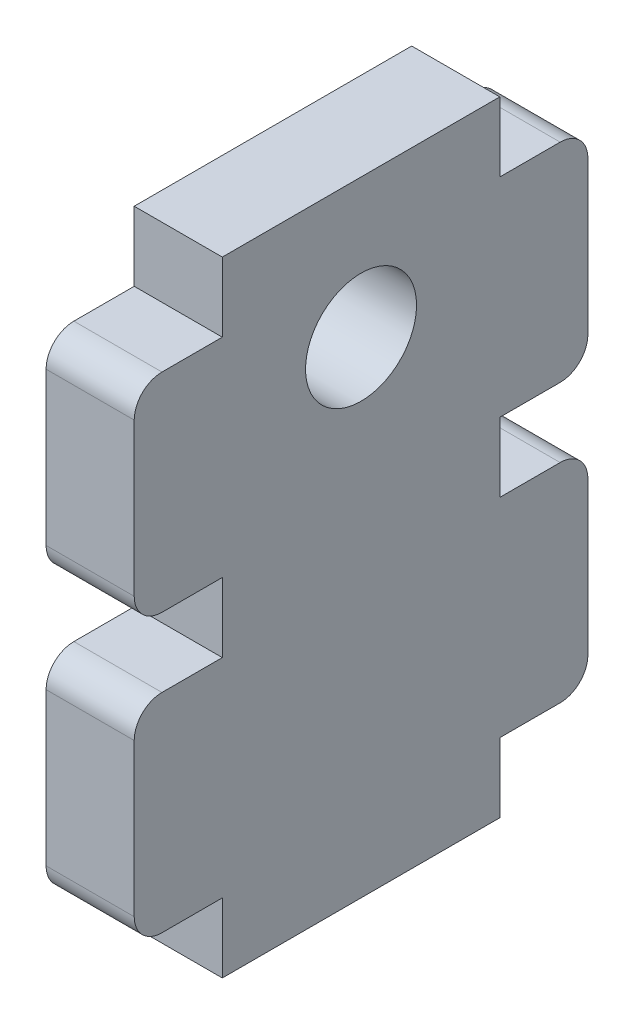
ISO-10303-21;
HEADER;
FILE_DESCRIPTION(('STEP AP214'),'2;1');
FILE_NAME('part.step','',(''),(''),'','','');
FILE_SCHEMA(('AUTOMOTIVE_DESIGN { 1 0 10303 214 1 1 1 1 }'));
ENDSEC;
DATA;
#1=APPLICATION_CONTEXT('core data for automotive mechanical design processes');
#2=APPLICATION_PROTOCOL_DEFINITION('international standard','automotive_design',2000,#1);
#3=PRODUCT_CONTEXT('',#1,'mechanical');
#4=PRODUCT('Part','Part','',(#3));
#5=PRODUCT_RELATED_PRODUCT_CATEGORY('part','',(#4));
#6=PRODUCT_DEFINITION_FORMATION('','',#4);
#7=PRODUCT_DEFINITION_CONTEXT('part definition',#1,'design');
#8=PRODUCT_DEFINITION('design','',#6,#7);
#9=PRODUCT_DEFINITION_SHAPE('','',#8);
#10=(LENGTH_UNIT() NAMED_UNIT(*) SI_UNIT(.MILLI.,.METRE.));
#11=(NAMED_UNIT(*) PLANE_ANGLE_UNIT() SI_UNIT($,.RADIAN.));
#12=(NAMED_UNIT(*) SI_UNIT($,.STERADIAN.) SOLID_ANGLE_UNIT());
#13=UNCERTAINTY_MEASURE_WITH_UNIT(LENGTH_MEASURE(1.E-05),#10,'distance_accuracy_value','');
#14=(GEOMETRIC_REPRESENTATION_CONTEXT(3) GLOBAL_UNCERTAINTY_ASSIGNED_CONTEXT((#13)) GLOBAL_UNIT_ASSIGNED_CONTEXT((#10,
#11,#12)) REPRESENTATION_CONTEXT('',''));
#15=CARTESIAN_POINT('',(0.,0.,0.));
#16=DIRECTION('',(0.,0.,1.));
#17=DIRECTION('',(1.,0.,0.));
#18=AXIS2_PLACEMENT_3D('',#15,#16,#17);
#19=CARTESIAN_POINT('',(6.35,0.,0.));
#20=DIRECTION('',(0.,0.,-1.));
#21=DIRECTION('',(-1.,0.,0.));
#22=AXIS2_PLACEMENT_3D('',#19,#20,#21);
#23=PLANE('',#22);
#24=DIRECTION('',(0.,-1.,0.));
#25=VECTOR('',#24,1.);
#26=CARTESIAN_POINT('',(0.,0.,0.));
#27=LINE('',#26,#25);
#28=CARTESIAN_POINT('',(0.,5.,0.));
#29=VERTEX_POINT('',#28);
#30=CARTESIAN_POINT('',(0.,0.,0.));
#31=VERTEX_POINT('',#30);
#32=EDGE_CURVE('E245',#29,#31,#27,.T.);
#33=ORIENTED_EDGE('',*,*,#32,.T.);
#34=DIRECTION('',(-1.,0.,0.));
#35=VECTOR('',#34,1.);
#36=CARTESIAN_POINT('',(6.35,0.,0.));
#37=LINE('',#36,#35);
#38=CARTESIAN_POINT('',(6.35,0.,0.));
#39=VERTEX_POINT('',#38);
#40=EDGE_CURVE('E227',#39,#31,#37,.T.);
#41=ORIENTED_EDGE('',*,*,#40,.F.);
#42=DIRECTION('',(0.,-1.,0.));
#43=VECTOR('',#42,1.);
#44=CARTESIAN_POINT('',(6.35,0.,0.));
#45=LINE('',#44,#43);
#46=CARTESIAN_POINT('',(6.35,5.,0.));
#47=VERTEX_POINT('',#46);
#48=EDGE_CURVE('E233',#47,#39,#45,.T.);
#49=ORIENTED_EDGE('',*,*,#48,.F.);
#50=DIRECTION('',(-1.,0.,0.));
#51=VECTOR('',#50,1.);
#52=CARTESIAN_POINT('',(6.35,5.,0.));
#53=LINE('',#52,#51);
#54=EDGE_CURVE('E360',#47,#29,#53,.T.);
#55=ORIENTED_EDGE('',*,*,#54,.T.);
#56=EDGE_LOOP('',(#33,#41,#49,#55));
#57=FACE_BOUND('',#56,.T.);
#58=ADVANCED_FACE('F37',(#57),#23,.F.);
#59=CARTESIAN_POINT('',(6.35,0.,0.));
#60=DIRECTION('',(0.,1.,0.));
#61=DIRECTION('',(0.,0.,1.));
#62=AXIS2_PLACEMENT_3D('',#59,#60,#61);
#63=PLANE('',#62);
#64=DIRECTION('',(0.,0.,-1.));
#65=VECTOR('',#64,1.);
#66=CARTESIAN_POINT('',(0.,0.,0.));
#67=LINE('',#66,#65);
#68=CARTESIAN_POINT('',(0.,0.,-20.));
#69=VERTEX_POINT('',#68);
#70=EDGE_CURVE('E402',#31,#69,#67,.T.);
#71=ORIENTED_EDGE('',*,*,#70,.T.);
#72=DIRECTION('',(-1.,0.,0.));
#73=VECTOR('',#72,1.);
#74=CARTESIAN_POINT('',(6.35,0.,-20.));
#75=LINE('',#74,#73);
#76=CARTESIAN_POINT('',(6.35,0.,-20.));
#77=VERTEX_POINT('',#76);
#78=EDGE_CURVE('E230',#77,#69,#75,.T.);
#79=ORIENTED_EDGE('',*,*,#78,.F.);
#80=DIRECTION('',(0.,0.,-1.));
#81=VECTOR('',#80,1.);
#82=CARTESIAN_POINT('',(6.35,0.,0.));
#83=LINE('',#82,#81);
#84=EDGE_CURVE('E223',#39,#77,#83,.T.);
#85=ORIENTED_EDGE('',*,*,#84,.F.);
#86=ORIENTED_EDGE('',*,*,#40,.T.);
#87=EDGE_LOOP('',(#71,#79,#85,#86));
#88=FACE_BOUND('',#87,.T.);
#89=ADVANCED_FACE('F225',(#88),#63,.F.);
#90=CARTESIAN_POINT('',(6.35,0.,-20.));
#91=DIRECTION('',(0.,0.,1.));
#92=DIRECTION('',(0.,-1.,0.));
#93=AXIS2_PLACEMENT_3D('',#90,#91,#92);
#94=PLANE('',#93);
#95=DIRECTION('',(0.,1.,0.));
#96=VECTOR('',#95,1.);
#97=CARTESIAN_POINT('',(0.,0.,-20.));
#98=LINE('',#97,#96);
#99=CARTESIAN_POINT('',(0.,5.,-20.));
#100=VERTEX_POINT('',#99);
#101=EDGE_CURVE('E396',#69,#100,#98,.T.);
#102=ORIENTED_EDGE('',*,*,#101,.T.);
#103=DIRECTION('',(-1.,0.,0.));
#104=VECTOR('',#103,1.);
#105=CARTESIAN_POINT('',(6.35,5.,-20.));
#106=LINE('',#105,#104);
#107=CARTESIAN_POINT('',(6.35,5.,-20.));
#108=VERTEX_POINT('',#107);
#109=EDGE_CURVE('E250',#108,#100,#106,.T.);
#110=ORIENTED_EDGE('',*,*,#109,.F.);
#111=DIRECTION('',(0.,1.,0.));
#112=VECTOR('',#111,1.);
#113=CARTESIAN_POINT('',(6.35,0.,-20.));
#114=LINE('',#113,#112);
#115=EDGE_CURVE('E232',#77,#108,#114,.T.);
#116=ORIENTED_EDGE('',*,*,#115,.F.);
#117=ORIENTED_EDGE('',*,*,#78,.T.);
#118=EDGE_LOOP('',(#102,#110,#116,#117));
#119=FACE_BOUND('',#118,.T.);
#120=ADVANCED_FACE('F445',(#119),#94,.F.);
#121=CARTESIAN_POINT('',(6.35,5.,-20.));
#122=DIRECTION('',(0.,1.,0.));
#123=DIRECTION('',(0.,0.,1.));
#124=AXIS2_PLACEMENT_3D('',#121,#122,#123);
#125=PLANE('',#124);
#126=DIRECTION('',(0.,0.,-1.));
#127=VECTOR('',#126,1.);
#128=CARTESIAN_POINT('',(0.,5.,-20.));
#129=LINE('',#128,#127);
#130=CARTESIAN_POINT('',(0.,5.,-24.35));
#131=VERTEX_POINT('',#130);
#132=EDGE_CURVE('E391',#100,#131,#129,.T.);
#133=ORIENTED_EDGE('',*,*,#132,.T.);
#134=DIRECTION('',(-1.,0.,0.));
#135=VECTOR('',#134,1.);
#136=CARTESIAN_POINT('',(6.35,5.,-24.35));
#137=LINE('',#136,#135);
#138=CARTESIAN_POINT('',(6.35,5.,-24.35));
#139=VERTEX_POINT('',#138);
#140=EDGE_CURVE('E272',#131,#139,#137,.F.);
#141=ORIENTED_EDGE('',*,*,#140,.T.);
#142=DIRECTION('',(0.,0.,-1.));
#143=VECTOR('',#142,1.);
#144=CARTESIAN_POINT('',(6.35,5.,-20.));
#145=LINE('',#144,#143);
#146=EDGE_CURVE('E393',#108,#139,#145,.T.);
#147=ORIENTED_EDGE('',*,*,#146,.F.);
#148=ORIENTED_EDGE('',*,*,#109,.T.);
#149=EDGE_LOOP('',(#133,#141,#147,#148));
#150=FACE_BOUND('',#149,.T.);
#151=ADVANCED_FACE('F390',(#150),#125,.F.);
#152=CARTESIAN_POINT('',(6.35,20.,-26.35));
#153=DIRECTION('',(0.,0.,1.));
#154=DIRECTION('',(1.,0.,0.));
#155=AXIS2_PLACEMENT_3D('',#152,#153,#154);
#156=PLANE('',#155);
#157=DIRECTION('',(0.,1.,0.));
#158=VECTOR('',#157,1.);
#159=CARTESIAN_POINT('',(6.35,20.,-26.35));
#160=LINE('',#159,#158);
#161=CARTESIAN_POINT('',(6.35,7.,-26.35));
#162=VERTEX_POINT('',#161);
#163=CARTESIAN_POINT('',(6.35,18.,-26.35));
#164=VERTEX_POINT('',#163);
#165=EDGE_CURVE('E490',#162,#164,#160,.T.);
#166=ORIENTED_EDGE('',*,*,#165,.F.);
#167=DIRECTION('',(-1.,0.,0.));
#168=VECTOR('',#167,1.);
#169=CARTESIAN_POINT('',(6.35,7.,-26.35));
#170=LINE('',#169,#168);
#171=CARTESIAN_POINT('',(0.,7.,-26.35));
#172=VERTEX_POINT('',#171);
#173=EDGE_CURVE('E248',#162,#172,#170,.T.);
#174=ORIENTED_EDGE('',*,*,#173,.T.);
#175=DIRECTION('',(0.,1.,0.));
#176=VECTOR('',#175,1.);
#177=CARTESIAN_POINT('',(0.,20.,-26.35));
#178=LINE('',#177,#176);
#179=CARTESIAN_POINT('',(0.,18.,-26.35));
#180=VERTEX_POINT('',#179);
#181=EDGE_CURVE('E397',#172,#180,#178,.T.);
#182=ORIENTED_EDGE('',*,*,#181,.T.);
#183=DIRECTION('',(-1.,0.,0.));
#184=VECTOR('',#183,1.);
#185=CARTESIAN_POINT('',(6.35,18.,-26.35));
#186=LINE('',#185,#184);
#187=EDGE_CURVE('E246',#180,#164,#186,.F.);
#188=ORIENTED_EDGE('',*,*,#187,.T.);
#189=EDGE_LOOP('',(#166,#174,#182,#188));
#190=FACE_BOUND('',#189,.T.);
#191=ADVANCED_FACE('F576',(#190),#156,.F.);
#192=CARTESIAN_POINT('',(6.35,20.,-20.));
#193=DIRECTION('',(0.,-1.,0.));
#194=DIRECTION('',(0.,0.,-1.));
#195=AXIS2_PLACEMENT_3D('',#192,#193,#194);
#196=PLANE('',#195);
#197=DIRECTION('',(0.,0.,1.));
#198=VECTOR('',#197,1.);
#199=CARTESIAN_POINT('',(6.35,20.,-20.));
#200=LINE('',#199,#198);
#201=CARTESIAN_POINT('',(6.35,20.,-24.35));
#202=VERTEX_POINT('',#201);
#203=CARTESIAN_POINT('',(6.35,20.,-20.));
#204=VERTEX_POINT('',#203);
#205=EDGE_CURVE('E495',#202,#204,#200,.T.);
#206=ORIENTED_EDGE('',*,*,#205,.F.);
#207=DIRECTION('',(-1.,0.,0.));
#208=VECTOR('',#207,1.);
#209=CARTESIAN_POINT('',(6.35,20.,-24.35));
#210=LINE('',#209,#208);
#211=CARTESIAN_POINT('',(0.,20.,-24.35));
#212=VERTEX_POINT('',#211);
#213=EDGE_CURVE('E289',#202,#212,#210,.T.);
#214=ORIENTED_EDGE('',*,*,#213,.T.);
#215=DIRECTION('',(0.,0.,1.));
#216=VECTOR('',#215,1.);
#217=CARTESIAN_POINT('',(0.,20.,-20.));
#218=LINE('',#217,#216);
#219=CARTESIAN_POINT('',(0.,20.,-20.));
#220=VERTEX_POINT('',#219);
#221=EDGE_CURVE('E400',#212,#220,#218,.T.);
#222=ORIENTED_EDGE('',*,*,#221,.T.);
#223=DIRECTION('',(-1.,0.,0.));
#224=VECTOR('',#223,1.);
#225=CARTESIAN_POINT('',(6.35,20.,-20.));
#226=LINE('',#225,#224);
#227=EDGE_CURVE('E382',#204,#220,#226,.T.);
#228=ORIENTED_EDGE('',*,*,#227,.F.);
#229=EDGE_LOOP('',(#206,#214,#222,#228));
#230=FACE_BOUND('',#229,.T.);
#231=ADVANCED_FACE('F572',(#230),#196,.F.);
#232=CARTESIAN_POINT('',(6.35,20.,-20.));
#233=DIRECTION('',(0.,0.,1.));
#234=DIRECTION('',(0.,-1.,0.));
#235=AXIS2_PLACEMENT_3D('',#232,#233,#234);
#236=PLANE('',#235);
#237=DIRECTION('',(0.,1.,0.));
#238=VECTOR('',#237,1.);
#239=CARTESIAN_POINT('',(0.,20.,-20.));
#240=LINE('',#239,#238);
#241=CARTESIAN_POINT('',(0.,25.,-20.));
#242=VERTEX_POINT('',#241);
#243=EDGE_CURVE('E407',#220,#242,#240,.T.);
#244=ORIENTED_EDGE('',*,*,#243,.T.);
#245=DIRECTION('',(-1.,0.,0.));
#246=VECTOR('',#245,1.);
#247=CARTESIAN_POINT('',(6.35,25.,-20.));
#248=LINE('',#247,#246);
#249=CARTESIAN_POINT('',(6.35,25.,-20.));
#250=VERTEX_POINT('',#249);
#251=EDGE_CURVE('E379',#250,#242,#248,.T.);
#252=ORIENTED_EDGE('',*,*,#251,.F.);
#253=DIRECTION('',(0.,1.,0.));
#254=VECTOR('',#253,1.);
#255=CARTESIAN_POINT('',(6.35,20.,-20.));
#256=LINE('',#255,#254);
#257=EDGE_CURVE('E497',#204,#250,#256,.T.);
#258=ORIENTED_EDGE('',*,*,#257,.F.);
#259=ORIENTED_EDGE('',*,*,#227,.T.);
#260=EDGE_LOOP('',(#244,#252,#258,#259));
#261=FACE_BOUND('',#260,.T.);
#262=ADVANCED_FACE('F568',(#261),#236,.F.);
#263=CARTESIAN_POINT('',(6.35,25.,-20.));
#264=DIRECTION('',(0.,1.,0.));
#265=DIRECTION('',(0.,0.,1.));
#266=AXIS2_PLACEMENT_3D('',#263,#264,#265);
#267=PLANE('',#266);
#268=DIRECTION('',(0.,0.,-1.));
#269=VECTOR('',#268,1.);
#270=CARTESIAN_POINT('',(0.,25.,-20.));
#271=LINE('',#270,#269);
#272=CARTESIAN_POINT('',(0.,25.,-24.35));
#273=VERTEX_POINT('',#272);
#274=EDGE_CURVE('E409',#242,#273,#271,.T.);
#275=ORIENTED_EDGE('',*,*,#274,.T.);
#276=DIRECTION('',(-1.,0.,0.));
#277=VECTOR('',#276,1.);
#278=CARTESIAN_POINT('',(6.35,25.,-24.35));
#279=LINE('',#278,#277);
#280=CARTESIAN_POINT('',(6.35,25.,-24.35));
#281=VERTEX_POINT('',#280);
#282=EDGE_CURVE('E297',#273,#281,#279,.F.);
#283=ORIENTED_EDGE('',*,*,#282,.T.);
#284=DIRECTION('',(0.,0.,-1.));
#285=VECTOR('',#284,1.);
#286=CARTESIAN_POINT('',(6.35,25.,-20.));
#287=LINE('',#286,#285);
#288=EDGE_CURVE('E499',#250,#281,#287,.T.);
#289=ORIENTED_EDGE('',*,*,#288,.F.);
#290=ORIENTED_EDGE('',*,*,#251,.T.);
#291=EDGE_LOOP('',(#275,#283,#289,#290));
#292=FACE_BOUND('',#291,.T.);
#293=ADVANCED_FACE('F564',(#292),#267,.F.);
#294=CARTESIAN_POINT('',(6.35,40.,-26.35));
#295=DIRECTION('',(0.,0.,1.));
#296=DIRECTION('',(0.,-1.,0.));
#297=AXIS2_PLACEMENT_3D('',#294,#295,#296);
#298=PLANE('',#297);
#299=DIRECTION('',(0.,1.,0.));
#300=VECTOR('',#299,1.);
#301=CARTESIAN_POINT('',(6.35,40.,-26.35));
#302=LINE('',#301,#300);
#303=CARTESIAN_POINT('',(6.35,27.,-26.35));
#304=VERTEX_POINT('',#303);
#305=CARTESIAN_POINT('',(6.35,38.,-26.35));
#306=VERTEX_POINT('',#305);
#307=EDGE_CURVE('E502',#304,#306,#302,.T.);
#308=ORIENTED_EDGE('',*,*,#307,.F.);
#309=DIRECTION('',(-1.,0.,0.));
#310=VECTOR('',#309,1.);
#311=CARTESIAN_POINT('',(6.35,27.,-26.35));
#312=LINE('',#311,#310);
#313=CARTESIAN_POINT('',(0.,27.,-26.35));
#314=VERTEX_POINT('',#313);
#315=EDGE_CURVE('E294',#304,#314,#312,.T.);
#316=ORIENTED_EDGE('',*,*,#315,.T.);
#317=DIRECTION('',(0.,1.,0.));
#318=VECTOR('',#317,1.);
#319=CARTESIAN_POINT('',(0.,40.,-26.35));
#320=LINE('',#319,#318);
#321=CARTESIAN_POINT('',(0.,38.,-26.35));
#322=VERTEX_POINT('',#321);
#323=EDGE_CURVE('E412',#314,#322,#320,.T.);
#324=ORIENTED_EDGE('',*,*,#323,.T.);
#325=DIRECTION('',(-1.,0.,0.));
#326=VECTOR('',#325,1.);
#327=CARTESIAN_POINT('',(6.35,38.,-26.35));
#328=LINE('',#327,#326);
#329=EDGE_CURVE('E292',#322,#306,#328,.F.);
#330=ORIENTED_EDGE('',*,*,#329,.T.);
#331=EDGE_LOOP('',(#308,#316,#324,#330));
#332=FACE_BOUND('',#331,.T.);
#333=ADVANCED_FACE('F560',(#332),#298,.F.);
#334=CARTESIAN_POINT('',(6.35,40.,-20.));
#335=DIRECTION('',(0.,-1.,0.));
#336=DIRECTION('',(0.,0.,-1.));
#337=AXIS2_PLACEMENT_3D('',#334,#335,#336);
#338=PLANE('',#337);
#339=DIRECTION('',(0.,0.,1.));
#340=VECTOR('',#339,1.);
#341=CARTESIAN_POINT('',(6.35,40.,-20.));
#342=LINE('',#341,#340);
#343=CARTESIAN_POINT('',(6.35,40.,-24.35));
#344=VERTEX_POINT('',#343);
#345=CARTESIAN_POINT('',(6.35,40.,-20.));
#346=VERTEX_POINT('',#345);
#347=EDGE_CURVE('E505',#344,#346,#342,.T.);
#348=ORIENTED_EDGE('',*,*,#347,.F.);
#349=DIRECTION('',(-1.,0.,0.));
#350=VECTOR('',#349,1.);
#351=CARTESIAN_POINT('',(6.35,40.,-24.35));
#352=LINE('',#351,#350);
#353=CARTESIAN_POINT('',(0.,40.,-24.35));
#354=VERTEX_POINT('',#353);
#355=EDGE_CURVE('E299',#344,#354,#352,.T.);
#356=ORIENTED_EDGE('',*,*,#355,.T.);
#357=DIRECTION('',(0.,0.,1.));
#358=VECTOR('',#357,1.);
#359=CARTESIAN_POINT('',(0.,40.,-20.));
#360=LINE('',#359,#358);
#361=CARTESIAN_POINT('',(0.,40.,-20.));
#362=VERTEX_POINT('',#361);
#363=EDGE_CURVE('E415',#354,#362,#360,.T.);
#364=ORIENTED_EDGE('',*,*,#363,.T.);
#365=DIRECTION('',(-1.,0.,0.));
#366=VECTOR('',#365,1.);
#367=CARTESIAN_POINT('',(6.35,40.,-20.));
#368=LINE('',#367,#366);
#369=EDGE_CURVE('E376',#346,#362,#368,.T.);
#370=ORIENTED_EDGE('',*,*,#369,.F.);
#371=EDGE_LOOP('',(#348,#356,#364,#370));
#372=FACE_BOUND('',#371,.T.);
#373=ADVANCED_FACE('F556',(#372),#338,.F.);
#374=CARTESIAN_POINT('',(6.35,40.,-20.));
#375=DIRECTION('',(0.,0.,1.));
#376=DIRECTION('',(1.,0.,0.));
#377=AXIS2_PLACEMENT_3D('',#374,#375,#376);
#378=PLANE('',#377);
#379=DIRECTION('',(0.,1.,0.));
#380=VECTOR('',#379,1.);
#381=CARTESIAN_POINT('',(0.,40.,-20.));
#382=LINE('',#381,#380);
#383=CARTESIAN_POINT('',(0.,45.,-20.));
#384=VERTEX_POINT('',#383);
#385=EDGE_CURVE('E417',#362,#384,#382,.T.);
#386=ORIENTED_EDGE('',*,*,#385,.T.);
#387=DIRECTION('',(-1.,0.,0.));
#388=VECTOR('',#387,1.);
#389=CARTESIAN_POINT('',(6.35,45.,-20.));
#390=LINE('',#389,#388);
#391=CARTESIAN_POINT('',(6.35,45.,-20.));
#392=VERTEX_POINT('',#391);
#393=EDGE_CURVE('E373',#392,#384,#390,.T.);
#394=ORIENTED_EDGE('',*,*,#393,.F.);
#395=DIRECTION('',(0.,1.,0.));
#396=VECTOR('',#395,1.);
#397=CARTESIAN_POINT('',(6.35,40.,-20.));
#398=LINE('',#397,#396);
#399=EDGE_CURVE('E507',#346,#392,#398,.T.);
#400=ORIENTED_EDGE('',*,*,#399,.F.);
#401=ORIENTED_EDGE('',*,*,#369,.T.);
#402=EDGE_LOOP('',(#386,#394,#400,#401));
#403=FACE_BOUND('',#402,.T.);
#404=ADVANCED_FACE('F552',(#403),#378,.F.);
#405=CARTESIAN_POINT('',(6.35,45.,0.));
#406=DIRECTION('',(0.,-1.,0.));
#407=DIRECTION('',(0.,0.,-1.));
#408=AXIS2_PLACEMENT_3D('',#405,#406,#407);
#409=PLANE('',#408);
#410=DIRECTION('',(0.,0.,1.));
#411=VECTOR('',#410,1.);
#412=CARTESIAN_POINT('',(0.,45.,0.));
#413=LINE('',#412,#411);
#414=CARTESIAN_POINT('',(0.,45.,0.));
#415=VERTEX_POINT('',#414);
#416=EDGE_CURVE('E419',#384,#415,#413,.T.);
#417=ORIENTED_EDGE('',*,*,#416,.T.);
#418=DIRECTION('',(-1.,0.,0.));
#419=VECTOR('',#418,1.);
#420=CARTESIAN_POINT('',(6.35,45.,0.));
#421=LINE('',#420,#419);
#422=CARTESIAN_POINT('',(6.35,45.,0.));
#423=VERTEX_POINT('',#422);
#424=EDGE_CURVE('E370',#423,#415,#421,.T.);
#425=ORIENTED_EDGE('',*,*,#424,.F.);
#426=DIRECTION('',(0.,0.,1.));
#427=VECTOR('',#426,1.);
#428=CARTESIAN_POINT('',(6.35,45.,0.));
#429=LINE('',#428,#427);
#430=EDGE_CURVE('E509',#392,#423,#429,.T.);
#431=ORIENTED_EDGE('',*,*,#430,.F.);
#432=ORIENTED_EDGE('',*,*,#393,.T.);
#433=EDGE_LOOP('',(#417,#425,#431,#432));
#434=FACE_BOUND('',#433,.T.);
#435=ADVANCED_FACE('F548',(#434),#409,.F.);
#436=CARTESIAN_POINT('',(6.35,40.,0.));
#437=DIRECTION('',(0.,0.,-1.));
#438=DIRECTION('',(0.,1.,0.));
#439=AXIS2_PLACEMENT_3D('',#436,#437,#438);
#440=PLANE('',#439);
#441=DIRECTION('',(0.,-1.,0.));
#442=VECTOR('',#441,1.);
#443=CARTESIAN_POINT('',(0.,40.,0.));
#444=LINE('',#443,#442);
#445=CARTESIAN_POINT('',(0.,40.,0.));
#446=VERTEX_POINT('',#445);
#447=EDGE_CURVE('E421',#415,#446,#444,.T.);
#448=ORIENTED_EDGE('',*,*,#447,.T.);
#449=DIRECTION('',(-1.,0.,0.));
#450=VECTOR('',#449,1.);
#451=CARTESIAN_POINT('',(6.35,40.,0.));
#452=LINE('',#451,#450);
#453=CARTESIAN_POINT('',(6.35,40.,0.));
#454=VERTEX_POINT('',#453);
#455=EDGE_CURVE('E367',#454,#446,#452,.T.);
#456=ORIENTED_EDGE('',*,*,#455,.F.);
#457=DIRECTION('',(0.,-1.,0.));
#458=VECTOR('',#457,1.);
#459=CARTESIAN_POINT('',(6.35,40.,0.));
#460=LINE('',#459,#458);
#461=EDGE_CURVE('E511',#423,#454,#460,.T.);
#462=ORIENTED_EDGE('',*,*,#461,.F.);
#463=ORIENTED_EDGE('',*,*,#424,.T.);
#464=EDGE_LOOP('',(#448,#456,#462,#463));
#465=FACE_BOUND('',#464,.T.);
#466=ADVANCED_FACE('F545',(#465),#440,.F.);
#467=CARTESIAN_POINT('',(6.35,40.,0.));
#468=DIRECTION('',(0.,-1.,0.));
#469=DIRECTION('',(0.,0.,-1.));
#470=AXIS2_PLACEMENT_3D('',#467,#468,#469);
#471=PLANE('',#470);
#472=DIRECTION('',(0.,0.,1.));
#473=VECTOR('',#472,1.);
#474=CARTESIAN_POINT('',(0.,40.,0.));
#475=LINE('',#474,#473);
#476=CARTESIAN_POINT('',(0.,40.,4.34999999999999));
#477=VERTEX_POINT('',#476);
#478=EDGE_CURVE('E351',#446,#477,#475,.T.);
#479=ORIENTED_EDGE('',*,*,#478,.T.);
#480=DIRECTION('',(-1.,0.,0.));
#481=VECTOR('',#480,1.);
#482=CARTESIAN_POINT('',(6.35,40.,4.34999999999999));
#483=LINE('',#482,#481);
#484=CARTESIAN_POINT('',(6.35,40.,4.34999999999999));
#485=VERTEX_POINT('',#484);
#486=EDGE_CURVE('E11',#477,#485,#483,.F.);
#487=ORIENTED_EDGE('',*,*,#486,.T.);
#488=DIRECTION('',(0.,0.,1.));
#489=VECTOR('',#488,1.);
#490=CARTESIAN_POINT('',(6.35,40.,0.));
#491=LINE('',#490,#489);
#492=EDGE_CURVE('E332',#454,#485,#491,.T.);
#493=ORIENTED_EDGE('',*,*,#492,.F.);
#494=ORIENTED_EDGE('',*,*,#455,.T.);
#495=EDGE_LOOP('',(#479,#487,#493,#494));
#496=FACE_BOUND('',#495,.T.);
#497=ADVANCED_FACE('F426',(#496),#471,.F.);
#498=CARTESIAN_POINT('',(6.35,40.,6.34999999999999));
#499=DIRECTION('',(0.,0.,-1.));
#500=DIRECTION('',(0.,1.,0.));
#501=AXIS2_PLACEMENT_3D('',#498,#499,#500);
#502=PLANE('',#501);
#503=DIRECTION('',(0.,-1.,0.));
#504=VECTOR('',#503,1.);
#505=CARTESIAN_POINT('',(0.,40.,6.34999999999999));
#506=LINE('',#505,#504);
#507=CARTESIAN_POINT('',(0.,38.,6.34999999999999));
#508=VERTEX_POINT('',#507);
#509=CARTESIAN_POINT('',(0.,27.,6.34999999999999));
#510=VERTEX_POINT('',#509);
#511=EDGE_CURVE('E325',#508,#510,#506,.T.);
#512=ORIENTED_EDGE('',*,*,#511,.T.);
#513=DIRECTION('',(-1.,0.,0.));
#514=VECTOR('',#513,1.);
#515=CARTESIAN_POINT('',(6.35,27.,6.34999999999999));
#516=LINE('',#515,#514);
#517=CARTESIAN_POINT('',(6.35,27.,6.34999999999999));
#518=VERTEX_POINT('',#517);
#519=EDGE_CURVE('E45',#510,#518,#516,.F.);
#520=ORIENTED_EDGE('',*,*,#519,.T.);
#521=DIRECTION('',(0.,-1.,0.));
#522=VECTOR('',#521,1.);
#523=CARTESIAN_POINT('',(6.35,40.,6.34999999999999));
#524=LINE('',#523,#522);
#525=CARTESIAN_POINT('',(6.35,38.,6.34999999999999));
#526=VERTEX_POINT('',#525);
#527=EDGE_CURVE('E322',#526,#518,#524,.T.);
#528=ORIENTED_EDGE('',*,*,#527,.F.);
#529=DIRECTION('',(-1.,0.,0.));
#530=VECTOR('',#529,1.);
#531=CARTESIAN_POINT('',(6.35,38.,6.34999999999999));
#532=LINE('',#531,#530);
#533=EDGE_CURVE('E314',#526,#508,#532,.T.);
#534=ORIENTED_EDGE('',*,*,#533,.T.);
#535=EDGE_LOOP('',(#512,#520,#528,#534));
#536=FACE_BOUND('',#535,.T.);
#537=ADVANCED_FACE('F321',(#536),#502,.F.);
#538=CARTESIAN_POINT('',(6.35,25.,0.));
#539=DIRECTION('',(0.,1.,0.));
#540=DIRECTION('',(0.,0.,1.));
#541=AXIS2_PLACEMENT_3D('',#538,#539,#540);
#542=PLANE('',#541);
#543=DIRECTION('',(0.,0.,-1.));
#544=VECTOR('',#543,1.);
#545=CARTESIAN_POINT('',(6.35,25.,0.));
#546=LINE('',#545,#544);
#547=CARTESIAN_POINT('',(6.35,25.,4.34999999999999));
#548=VERTEX_POINT('',#547);
#549=CARTESIAN_POINT('',(6.35,25.,0.));
#550=VERTEX_POINT('',#549);
#551=EDGE_CURVE('E331',#548,#550,#546,.T.);
#552=ORIENTED_EDGE('',*,*,#551,.F.);
#553=DIRECTION('',(-1.,0.,0.));
#554=VECTOR('',#553,1.);
#555=CARTESIAN_POINT('',(6.35,25.,4.34999999999999));
#556=LINE('',#555,#554);
#557=CARTESIAN_POINT('',(0.,25.,4.34999999999999));
#558=VERTEX_POINT('',#557);
#559=EDGE_CURVE('E311',#548,#558,#556,.T.);
#560=ORIENTED_EDGE('',*,*,#559,.T.);
#561=DIRECTION('',(0.,0.,-1.));
#562=VECTOR('',#561,1.);
#563=CARTESIAN_POINT('',(0.,25.,0.));
#564=LINE('',#563,#562);
#565=CARTESIAN_POINT('',(0.,25.,0.));
#566=VERTEX_POINT('',#565);
#567=EDGE_CURVE('E340',#558,#566,#564,.T.);
#568=ORIENTED_EDGE('',*,*,#567,.T.);
#569=DIRECTION('',(-1.,0.,0.));
#570=VECTOR('',#569,1.);
#571=CARTESIAN_POINT('',(6.35,25.,0.));
#572=LINE('',#571,#570);
#573=EDGE_CURVE('E365',#550,#566,#572,.T.);
#574=ORIENTED_EDGE('',*,*,#573,.F.);
#575=EDGE_LOOP('',(#552,#560,#568,#574));
#576=FACE_BOUND('',#575,.T.);
#577=ADVANCED_FACE('F338',(#576),#542,.F.);
#578=CARTESIAN_POINT('',(6.35,20.,0.));
#579=DIRECTION('',(0.,0.,-1.));
#580=DIRECTION('',(0.,1.,0.));
#581=AXIS2_PLACEMENT_3D('',#578,#579,#580);
#582=PLANE('',#581);
#583=DIRECTION('',(0.,-1.,0.));
#584=VECTOR('',#583,1.);
#585=CARTESIAN_POINT('',(0.,20.,0.));
#586=LINE('',#585,#584);
#587=CARTESIAN_POINT('',(0.,20.,0.));
#588=VERTEX_POINT('',#587);
#589=EDGE_CURVE('E347',#566,#588,#586,.T.);
#590=ORIENTED_EDGE('',*,*,#589,.T.);
#591=DIRECTION('',(-1.,0.,0.));
#592=VECTOR('',#591,1.);
#593=CARTESIAN_POINT('',(6.35,20.,0.));
#594=LINE('',#593,#592);
#595=CARTESIAN_POINT('',(6.35,20.,0.));
#596=VERTEX_POINT('',#595);
#597=EDGE_CURVE('E362',#596,#588,#594,.T.);
#598=ORIENTED_EDGE('',*,*,#597,.F.);
#599=DIRECTION('',(0.,-1.,0.));
#600=VECTOR('',#599,1.);
#601=CARTESIAN_POINT('',(6.35,20.,0.));
#602=LINE('',#601,#600);
#603=EDGE_CURVE('E484',#550,#596,#602,.T.);
#604=ORIENTED_EDGE('',*,*,#603,.F.);
#605=ORIENTED_EDGE('',*,*,#573,.T.);
#606=EDGE_LOOP('',(#590,#598,#604,#605));
#607=FACE_BOUND('',#606,.T.);
#608=ADVANCED_FACE('F517',(#607),#582,.F.);
#609=CARTESIAN_POINT('',(6.35,20.,0.));
#610=DIRECTION('',(0.,-1.,0.));
#611=DIRECTION('',(0.,0.,-1.));
#612=AXIS2_PLACEMENT_3D('',#609,#610,#611);
#613=PLANE('',#612);
#614=DIRECTION('',(0.,0.,1.));
#615=VECTOR('',#614,1.);
#616=CARTESIAN_POINT('',(0.,20.,0.));
#617=LINE('',#616,#615);
#618=CARTESIAN_POINT('',(0.,20.,4.35));
#619=VERTEX_POINT('',#618);
#620=EDGE_CURVE('E349',#588,#619,#617,.T.);
#621=ORIENTED_EDGE('',*,*,#620,.T.);
#622=DIRECTION('',(-1.,0.,0.));
#623=VECTOR('',#622,1.);
#624=CARTESIAN_POINT('',(6.35,20.,4.35));
#625=LINE('',#624,#623);
#626=CARTESIAN_POINT('',(6.35,20.,4.35));
#627=VERTEX_POINT('',#626);
#628=EDGE_CURVE('E309',#619,#627,#625,.F.);
#629=ORIENTED_EDGE('',*,*,#628,.T.);
#630=DIRECTION('',(0.,0.,1.));
#631=VECTOR('',#630,1.);
#632=CARTESIAN_POINT('',(6.35,20.,0.));
#633=LINE('',#632,#631);
#634=EDGE_CURVE('E479',#596,#627,#633,.T.);
#635=ORIENTED_EDGE('',*,*,#634,.F.);
#636=ORIENTED_EDGE('',*,*,#597,.T.);
#637=EDGE_LOOP('',(#621,#629,#635,#636));
#638=FACE_BOUND('',#637,.T.);
#639=ADVANCED_FACE('F519',(#638),#613,.F.);
#640=CARTESIAN_POINT('',(6.35,5.,6.35));
#641=DIRECTION('',(0.,0.,-1.));
#642=DIRECTION('',(-1.,0.,0.));
#643=AXIS2_PLACEMENT_3D('',#640,#641,#642);
#644=PLANE('',#643);
#645=DIRECTION('',(0.,-1.,0.));
#646=VECTOR('',#645,1.);
#647=CARTESIAN_POINT('',(0.,5.,6.35));
#648=LINE('',#647,#646);
#649=CARTESIAN_POINT('',(0.,18.,6.35));
#650=VERTEX_POINT('',#649);
#651=CARTESIAN_POINT('',(0.,7.,6.35));
#652=VERTEX_POINT('',#651);
#653=EDGE_CURVE('E357',#650,#652,#648,.T.);
#654=ORIENTED_EDGE('',*,*,#653,.T.);
#655=DIRECTION('',(-1.,0.,0.));
#656=VECTOR('',#655,1.);
#657=CARTESIAN_POINT('',(6.35,7.,6.35));
#658=LINE('',#657,#656);
#659=CARTESIAN_POINT('',(6.35,7.,6.35));
#660=VERTEX_POINT('',#659);
#661=EDGE_CURVE('E60',#652,#660,#658,.F.);
#662=ORIENTED_EDGE('',*,*,#661,.T.);
#663=DIRECTION('',(0.,-1.,0.));
#664=VECTOR('',#663,1.);
#665=CARTESIAN_POINT('',(6.35,5.,6.35));
#666=LINE('',#665,#664);
#667=CARTESIAN_POINT('',(6.35,18.,6.35));
#668=VERTEX_POINT('',#667);
#669=EDGE_CURVE('E477',#668,#660,#666,.T.);
#670=ORIENTED_EDGE('',*,*,#669,.F.);
#671=DIRECTION('',(-1.,0.,0.));
#672=VECTOR('',#671,1.);
#673=CARTESIAN_POINT('',(6.35,18.,6.35));
#674=LINE('',#673,#672);
#675=EDGE_CURVE('E305',#668,#650,#674,.T.);
#676=ORIENTED_EDGE('',*,*,#675,.T.);
#677=EDGE_LOOP('',(#654,#662,#670,#676));
#678=FACE_BOUND('',#677,.T.);
#679=ADVANCED_FACE('F480',(#678),#644,.F.);
#680=CARTESIAN_POINT('',(6.35,5.,0.));
#681=DIRECTION('',(0.,1.,0.));
#682=DIRECTION('',(0.,0.,1.));
#683=AXIS2_PLACEMENT_3D('',#680,#681,#682);
#684=PLANE('',#683);
#685=DIRECTION('',(0.,0.,-1.));
#686=VECTOR('',#685,1.);
#687=CARTESIAN_POINT('',(6.35,5.,0.));
#688=LINE('',#687,#686);
#689=CARTESIAN_POINT('',(6.35,5.,4.35));
#690=VERTEX_POINT('',#689);
#691=EDGE_CURVE('E238',#690,#47,#688,.T.);
#692=ORIENTED_EDGE('',*,*,#691,.F.);
#693=DIRECTION('',(-1.,0.,0.));
#694=VECTOR('',#693,1.);
#695=CARTESIAN_POINT('',(6.35,5.,4.35));
#696=LINE('',#695,#694);
#697=CARTESIAN_POINT('',(0.,5.,4.35));
#698=VERTEX_POINT('',#697);
#699=EDGE_CURVE('E302',#690,#698,#696,.T.);
#700=ORIENTED_EDGE('',*,*,#699,.T.);
#701=DIRECTION('',(0.,0.,-1.));
#702=VECTOR('',#701,1.);
#703=CARTESIAN_POINT('',(0.,5.,0.));
#704=LINE('',#703,#702);
#705=EDGE_CURVE('E242',#698,#29,#704,.T.);
#706=ORIENTED_EDGE('',*,*,#705,.T.);
#707=ORIENTED_EDGE('',*,*,#54,.F.);
#708=EDGE_LOOP('',(#692,#700,#706,#707));
#709=FACE_BOUND('',#708,.T.);
#710=ADVANCED_FACE('F523',(#709),#684,.F.);
#711=CARTESIAN_POINT('',(6.35,0.,0.));
#712=DIRECTION('',(1.,0.,0.));
#713=DIRECTION('',(0.,0.,-1.));
#714=AXIS2_PLACEMENT_3D('',#711,#712,#713);
#715=PLANE('',#714);
#716=CARTESIAN_POINT('',(6.35,35.,-10.));
#717=DIRECTION('',(1.,0.,0.));
#718=DIRECTION('',(0.,0.,-1.));
#719=AXIS2_PLACEMENT_3D('',#716,#717,#718);
#720=CIRCLE('',#719,4.);
#721=CARTESIAN_POINT('',(6.35,35.,-14.));
#722=VERTEX_POINT('',#721);
#723=EDGE_CURVE('E725',#722,#722,#720,.T.);
#724=ORIENTED_EDGE('',*,*,#723,.F.);
#725=EDGE_LOOP('',(#724));
#726=FACE_BOUND('',#725,.T.);
#727=ORIENTED_EDGE('',*,*,#146,.T.);
#728=CARTESIAN_POINT('',(6.35,7.,-24.35));
#729=DIRECTION('',(1.,0.,0.));
#730=DIRECTION('',(0.,0.,-1.));
#731=AXIS2_PLACEMENT_3D('',#728,#729,#730);
#732=CIRCLE('',#731,2.);
#733=EDGE_CURVE('E287',#139,#162,#732,.T.);
#734=ORIENTED_EDGE('',*,*,#733,.T.);
#735=ORIENTED_EDGE('',*,*,#165,.T.);
#736=CARTESIAN_POINT('',(6.35,18.,-24.35));
#737=DIRECTION('',(1.,0.,0.));
#738=DIRECTION('',(0.,0.,-1.));
#739=AXIS2_PLACEMENT_3D('',#736,#737,#738);
#740=CIRCLE('',#739,2.);
#741=EDGE_CURVE('E285',#164,#202,#740,.T.);
#742=ORIENTED_EDGE('',*,*,#741,.T.);
#743=ORIENTED_EDGE('',*,*,#205,.T.);
#744=ORIENTED_EDGE('',*,*,#257,.T.);
#745=ORIENTED_EDGE('',*,*,#288,.T.);
#746=CARTESIAN_POINT('',(6.35,27.,-24.35));
#747=DIRECTION('',(1.,0.,0.));
#748=DIRECTION('',(0.,0.,-1.));
#749=AXIS2_PLACEMENT_3D('',#746,#747,#748);
#750=CIRCLE('',#749,2.);
#751=EDGE_CURVE('E283',#281,#304,#750,.T.);
#752=ORIENTED_EDGE('',*,*,#751,.T.);
#753=ORIENTED_EDGE('',*,*,#307,.T.);
#754=CARTESIAN_POINT('',(6.35,38.,-24.35));
#755=DIRECTION('',(1.,0.,0.));
#756=DIRECTION('',(0.,0.,-1.));
#757=AXIS2_PLACEMENT_3D('',#754,#755,#756);
#758=CIRCLE('',#757,2.);
#759=EDGE_CURVE('E281',#306,#344,#758,.T.);
#760=ORIENTED_EDGE('',*,*,#759,.T.);
#761=ORIENTED_EDGE('',*,*,#347,.T.);
#762=ORIENTED_EDGE('',*,*,#399,.T.);
#763=ORIENTED_EDGE('',*,*,#430,.T.);
#764=ORIENTED_EDGE('',*,*,#461,.T.);
#765=ORIENTED_EDGE('',*,*,#492,.T.);
#766=CARTESIAN_POINT('',(6.35,38.,4.34999999999999));
#767=DIRECTION('',(1.,0.,0.));
#768=DIRECTION('',(0.,0.,-1.));
#769=AXIS2_PLACEMENT_3D('',#766,#767,#768);
#770=CIRCLE('',#769,2.);
#771=EDGE_CURVE('E274',#485,#526,#770,.T.);
#772=ORIENTED_EDGE('',*,*,#771,.T.);
#773=ORIENTED_EDGE('',*,*,#527,.T.);
#774=CARTESIAN_POINT('',(6.35,27.,4.34999999999999));
#775=DIRECTION('',(1.,0.,0.));
#776=DIRECTION('',(0.,0.,-1.));
#777=AXIS2_PLACEMENT_3D('',#774,#775,#776);
#778=CIRCLE('',#777,2.);
#779=EDGE_CURVE('E276',#518,#548,#778,.T.);
#780=ORIENTED_EDGE('',*,*,#779,.T.);
#781=ORIENTED_EDGE('',*,*,#551,.T.);
#782=ORIENTED_EDGE('',*,*,#603,.T.);
#783=ORIENTED_EDGE('',*,*,#634,.T.);
#784=CARTESIAN_POINT('',(6.35,18.,4.35));
#785=DIRECTION('',(1.,0.,0.));
#786=DIRECTION('',(0.,0.,-1.));
#787=AXIS2_PLACEMENT_3D('',#784,#785,#786);
#788=CIRCLE('',#787,2.);
#789=EDGE_CURVE('E278',#627,#668,#788,.T.);
#790=ORIENTED_EDGE('',*,*,#789,.T.);
#791=ORIENTED_EDGE('',*,*,#669,.T.);
#792=CARTESIAN_POINT('',(6.35,7.,4.35));
#793=DIRECTION('',(1.,0.,0.));
#794=DIRECTION('',(0.,0.,-1.));
#795=AXIS2_PLACEMENT_3D('',#792,#793,#794);
#796=CIRCLE('',#795,2.);
#797=EDGE_CURVE('E52',#660,#690,#796,.T.);
#798=ORIENTED_EDGE('',*,*,#797,.T.);
#799=ORIENTED_EDGE('',*,*,#691,.T.);
#800=ORIENTED_EDGE('',*,*,#48,.T.);
#801=ORIENTED_EDGE('',*,*,#84,.T.);
#802=ORIENTED_EDGE('',*,*,#115,.T.);
#803=EDGE_LOOP('',(#727,#734,#735,#742,#743,#744,#745,#752,#753,#760,#761,#762,#763,#764,#765,
#772,#773,#780,#781,#782,#783,#790,#791,#798,#799,#800,#801,#802));
#804=FACE_BOUND('',#803,.T.);
#805=ADVANCED_FACE('F237',(#726,#804),#715,.T.);
#806=CARTESIAN_POINT('',(0.,0.,0.));
#807=DIRECTION('',(1.,0.,0.));
#808=DIRECTION('',(0.,0.,-1.));
#809=AXIS2_PLACEMENT_3D('',#806,#807,#808);
#810=PLANE('',#809);
#811=CARTESIAN_POINT('',(0.,35.,-10.));
#812=DIRECTION('',(1.,0.,0.));
#813=DIRECTION('',(0.,0.,-1.));
#814=AXIS2_PLACEMENT_3D('',#811,#812,#813);
#815=CIRCLE('',#814,4.);
#816=CARTESIAN_POINT('',(0.,35.,-14.));
#817=VERTEX_POINT('',#816);
#818=EDGE_CURVE('E488',#817,#817,#815,.T.);
#819=ORIENTED_EDGE('',*,*,#818,.T.);
#820=EDGE_LOOP('',(#819));
#821=FACE_BOUND('',#820,.T.);
#822=ORIENTED_EDGE('',*,*,#181,.F.);
#823=CARTESIAN_POINT('',(0.,7.,-24.35));
#824=DIRECTION('',(1.,0.,0.));
#825=DIRECTION('',(0.,0.,-1.));
#826=AXIS2_PLACEMENT_3D('',#823,#824,#825);
#827=CIRCLE('',#826,2.);
#828=EDGE_CURVE('E270',#172,#131,#827,.F.);
#829=ORIENTED_EDGE('',*,*,#828,.T.);
#830=ORIENTED_EDGE('',*,*,#132,.F.);
#831=ORIENTED_EDGE('',*,*,#101,.F.);
#832=ORIENTED_EDGE('',*,*,#70,.F.);
#833=ORIENTED_EDGE('',*,*,#32,.F.);
#834=ORIENTED_EDGE('',*,*,#705,.F.);
#835=CARTESIAN_POINT('',(0.,7.,4.35));
#836=DIRECTION('',(1.,0.,0.));
#837=DIRECTION('',(0.,0.,-1.));
#838=AXIS2_PLACEMENT_3D('',#835,#836,#837);
#839=CIRCLE('',#838,2.);
#840=EDGE_CURVE('E262',#698,#652,#839,.F.);
#841=ORIENTED_EDGE('',*,*,#840,.T.);
#842=ORIENTED_EDGE('',*,*,#653,.F.);
#843=CARTESIAN_POINT('',(0.,18.,4.35));
#844=DIRECTION('',(1.,0.,0.));
#845=DIRECTION('',(0.,0.,-1.));
#846=AXIS2_PLACEMENT_3D('',#843,#844,#845);
#847=CIRCLE('',#846,2.);
#848=EDGE_CURVE('E260',#650,#619,#847,.F.);
#849=ORIENTED_EDGE('',*,*,#848,.T.);
#850=ORIENTED_EDGE('',*,*,#620,.F.);
#851=ORIENTED_EDGE('',*,*,#589,.F.);
#852=ORIENTED_EDGE('',*,*,#567,.F.);
#853=CARTESIAN_POINT('',(0.,27.,4.34999999999999));
#854=DIRECTION('',(1.,0.,0.));
#855=DIRECTION('',(0.,0.,-1.));
#856=AXIS2_PLACEMENT_3D('',#853,#854,#855);
#857=CIRCLE('',#856,2.);
#858=EDGE_CURVE('E258',#558,#510,#857,.F.);
#859=ORIENTED_EDGE('',*,*,#858,.T.);
#860=ORIENTED_EDGE('',*,*,#511,.F.);
#861=CARTESIAN_POINT('',(0.,38.,4.34999999999999));
#862=DIRECTION('',(1.,0.,0.));
#863=DIRECTION('',(0.,0.,-1.));
#864=AXIS2_PLACEMENT_3D('',#861,#862,#863);
#865=CIRCLE('',#864,2.);
#866=EDGE_CURVE('E256',#508,#477,#865,.F.);
#867=ORIENTED_EDGE('',*,*,#866,.T.);
#868=ORIENTED_EDGE('',*,*,#478,.F.);
#869=ORIENTED_EDGE('',*,*,#447,.F.);
#870=ORIENTED_EDGE('',*,*,#416,.F.);
#871=ORIENTED_EDGE('',*,*,#385,.F.);
#872=ORIENTED_EDGE('',*,*,#363,.F.);
#873=CARTESIAN_POINT('',(0.,38.,-24.35));
#874=DIRECTION('',(1.,0.,0.));
#875=DIRECTION('',(0.,0.,-1.));
#876=AXIS2_PLACEMENT_3D('',#873,#874,#875);
#877=CIRCLE('',#876,2.);
#878=EDGE_CURVE('E264',#354,#322,#877,.F.);
#879=ORIENTED_EDGE('',*,*,#878,.T.);
#880=ORIENTED_EDGE('',*,*,#323,.F.);
#881=CARTESIAN_POINT('',(0.,27.,-24.35));
#882=DIRECTION('',(1.,0.,0.));
#883=DIRECTION('',(0.,0.,-1.));
#884=AXIS2_PLACEMENT_3D('',#881,#882,#883);
#885=CIRCLE('',#884,2.);
#886=EDGE_CURVE('E266',#314,#273,#885,.F.);
#887=ORIENTED_EDGE('',*,*,#886,.T.);
#888=ORIENTED_EDGE('',*,*,#274,.F.);
#889=ORIENTED_EDGE('',*,*,#243,.F.);
#890=ORIENTED_EDGE('',*,*,#221,.F.);
#891=CARTESIAN_POINT('',(0.,18.,-24.35));
#892=DIRECTION('',(1.,0.,0.));
#893=DIRECTION('',(0.,0.,-1.));
#894=AXIS2_PLACEMENT_3D('',#891,#892,#893);
#895=CIRCLE('',#894,2.);
#896=EDGE_CURVE('E268',#212,#180,#895,.F.);
#897=ORIENTED_EDGE('',*,*,#896,.T.);
#898=EDGE_LOOP('',(#822,#829,#830,#831,#832,#833,#834,#841,#842,#849,#850,#851,#852,#859,#860,
#867,#868,#869,#870,#871,#872,#879,#880,#887,#888,#889,#890,#897));
#899=FACE_BOUND('',#898,.T.);
#900=ADVANCED_FACE('F345',(#821,#899),#810,.F.);
#901=CARTESIAN_POINT('',(6.35,7.,-24.35));
#902=DIRECTION('',(-1.,0.,0.));
#903=DIRECTION('',(0.,0.,1.));
#904=AXIS2_PLACEMENT_3D('',#901,#902,#903);
#905=CYLINDRICAL_SURFACE('',#904,2.);
#906=ORIENTED_EDGE('',*,*,#733,.F.);
#907=ORIENTED_EDGE('',*,*,#140,.F.);
#908=ORIENTED_EDGE('',*,*,#828,.F.);
#909=ORIENTED_EDGE('',*,*,#173,.F.);
#910=EDGE_LOOP('',(#906,#907,#908,#909));
#911=FACE_BOUND('',#910,.T.);
#912=ADVANCED_FACE('F449',(#911),#905,.T.);
#913=CARTESIAN_POINT('',(6.35,18.,-24.35));
#914=DIRECTION('',(-1.,0.,0.));
#915=DIRECTION('',(0.,0.,1.));
#916=AXIS2_PLACEMENT_3D('',#913,#914,#915);
#917=CYLINDRICAL_SURFACE('',#916,2.);
#918=ORIENTED_EDGE('',*,*,#741,.F.);
#919=ORIENTED_EDGE('',*,*,#187,.F.);
#920=ORIENTED_EDGE('',*,*,#896,.F.);
#921=ORIENTED_EDGE('',*,*,#213,.F.);
#922=EDGE_LOOP('',(#918,#919,#920,#921));
#923=FACE_BOUND('',#922,.T.);
#924=ADVANCED_FACE('F452',(#923),#917,.T.);
#925=CARTESIAN_POINT('',(6.35,27.,-24.35));
#926=DIRECTION('',(-1.,0.,0.));
#927=DIRECTION('',(0.,0.,1.));
#928=AXIS2_PLACEMENT_3D('',#925,#926,#927);
#929=CYLINDRICAL_SURFACE('',#928,2.);
#930=ORIENTED_EDGE('',*,*,#751,.F.);
#931=ORIENTED_EDGE('',*,*,#282,.F.);
#932=ORIENTED_EDGE('',*,*,#886,.F.);
#933=ORIENTED_EDGE('',*,*,#315,.F.);
#934=EDGE_LOOP('',(#930,#931,#932,#933));
#935=FACE_BOUND('',#934,.T.);
#936=ADVANCED_FACE('F456',(#935),#929,.T.);
#937=CARTESIAN_POINT('',(6.35,38.,-24.35));
#938=DIRECTION('',(-1.,0.,0.));
#939=DIRECTION('',(0.,0.,1.));
#940=AXIS2_PLACEMENT_3D('',#937,#938,#939);
#941=CYLINDRICAL_SURFACE('',#940,2.);
#942=ORIENTED_EDGE('',*,*,#759,.F.);
#943=ORIENTED_EDGE('',*,*,#329,.F.);
#944=ORIENTED_EDGE('',*,*,#878,.F.);
#945=ORIENTED_EDGE('',*,*,#355,.F.);
#946=EDGE_LOOP('',(#942,#943,#944,#945));
#947=FACE_BOUND('',#946,.T.);
#948=ADVANCED_FACE('F460',(#947),#941,.T.);
#949=CARTESIAN_POINT('',(6.35,7.,4.35));
#950=DIRECTION('',(-1.,0.,0.));
#951=DIRECTION('',(0.,0.,1.));
#952=AXIS2_PLACEMENT_3D('',#949,#950,#951);
#953=CYLINDRICAL_SURFACE('',#952,2.);
#954=ORIENTED_EDGE('',*,*,#797,.F.);
#955=ORIENTED_EDGE('',*,*,#661,.F.);
#956=ORIENTED_EDGE('',*,*,#840,.F.);
#957=ORIENTED_EDGE('',*,*,#699,.F.);
#958=EDGE_LOOP('',(#954,#955,#956,#957));
#959=FACE_BOUND('',#958,.T.);
#960=ADVANCED_FACE('F464',(#959),#953,.T.);
#961=CARTESIAN_POINT('',(6.35,18.,4.35));
#962=DIRECTION('',(-1.,0.,0.));
#963=DIRECTION('',(0.,0.,1.));
#964=AXIS2_PLACEMENT_3D('',#961,#962,#963);
#965=CYLINDRICAL_SURFACE('',#964,2.);
#966=ORIENTED_EDGE('',*,*,#789,.F.);
#967=ORIENTED_EDGE('',*,*,#628,.F.);
#968=ORIENTED_EDGE('',*,*,#848,.F.);
#969=ORIENTED_EDGE('',*,*,#675,.F.);
#970=EDGE_LOOP('',(#966,#967,#968,#969));
#971=FACE_BOUND('',#970,.T.);
#972=ADVANCED_FACE('F439',(#971),#965,.T.);
#973=CARTESIAN_POINT('',(6.35,27.,4.34999999999999));
#974=DIRECTION('',(-1.,0.,0.));
#975=DIRECTION('',(0.,0.,1.));
#976=AXIS2_PLACEMENT_3D('',#973,#974,#975);
#977=CYLINDRICAL_SURFACE('',#976,2.);
#978=ORIENTED_EDGE('',*,*,#779,.F.);
#979=ORIENTED_EDGE('',*,*,#519,.F.);
#980=ORIENTED_EDGE('',*,*,#858,.F.);
#981=ORIENTED_EDGE('',*,*,#559,.F.);
#982=EDGE_LOOP('',(#978,#979,#980,#981));
#983=FACE_BOUND('',#982,.T.);
#984=ADVANCED_FACE('F335',(#983),#977,.T.);
#985=CARTESIAN_POINT('',(6.35,38.,4.34999999999999));
#986=DIRECTION('',(-1.,0.,0.));
#987=DIRECTION('',(0.,0.,1.));
#988=AXIS2_PLACEMENT_3D('',#985,#986,#987);
#989=CYLINDRICAL_SURFACE('',#988,2.);
#990=ORIENTED_EDGE('',*,*,#771,.F.);
#991=ORIENTED_EDGE('',*,*,#486,.F.);
#992=ORIENTED_EDGE('',*,*,#866,.F.);
#993=ORIENTED_EDGE('',*,*,#533,.F.);
#994=EDGE_LOOP('',(#990,#991,#992,#993));
#995=FACE_BOUND('',#994,.T.);
#996=ADVANCED_FACE('F39',(#995),#989,.T.);
#997=CARTESIAN_POINT('',(0.,35.,-10.));
#998=DIRECTION('',(1.,0.,0.));
#999=DIRECTION('',(0.,0.,-1.));
#1000=AXIS2_PLACEMENT_3D('',#997,#998,#999);
#1001=CYLINDRICAL_SURFACE('',#1000,4.);
#1002=ORIENTED_EDGE('',*,*,#818,.F.);
#1003=EDGE_LOOP('',(#1002));
#1004=FACE_BOUND('',#1003,.T.);
#1005=ORIENTED_EDGE('',*,*,#723,.T.);
#1006=EDGE_LOOP('',(#1005));
#1007=FACE_BOUND('',#1006,.T.);
#1008=ADVANCED_FACE('F432',(#1004,#1007),#1001,.F.);
#1009=CLOSED_SHELL('',(#58,#89,#120,#151,#191,#231,#262,#293,#333,#373,#404,#435,#466,#497,#537,
#577,#608,#639,#679,#710,#805,#900,#912,#924,#936,#948,#960,#972,#984,#996,#1008));
#1010=MANIFOLD_SOLID_BREP('B2',#1009);
#1011=ADVANCED_BREP_SHAPE_REPRESENTATION('',(#18,#1010),#14);
#1012=SHAPE_DEFINITION_REPRESENTATION(#9,#1011);
ENDSEC;
END-ISO-10303-21;
